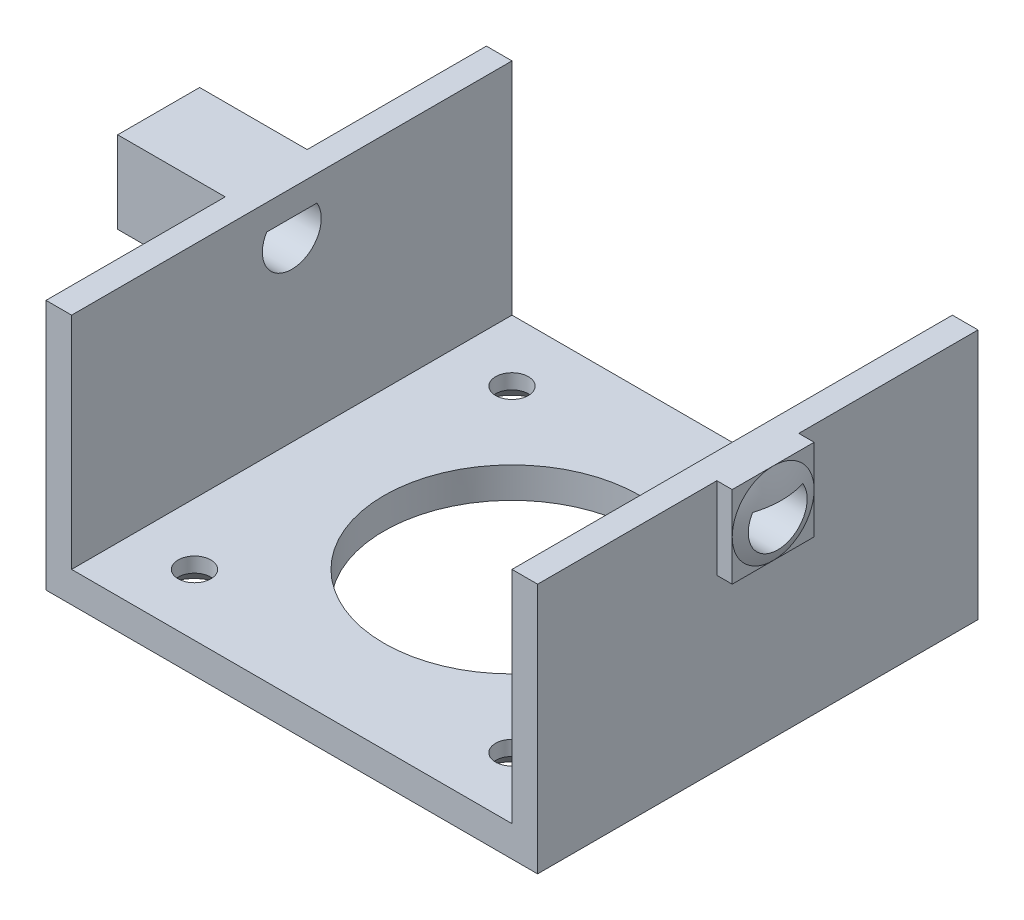
ISO-10303-21;
HEADER;
FILE_DESCRIPTION(('STEP AP214'),'2;1');
FILE_NAME('part.step','',(''),(''),'','','');
FILE_SCHEMA(('AUTOMOTIVE_DESIGN { 1 0 10303 214 1 1 1 1 }'));
ENDSEC;
DATA;
#1=APPLICATION_CONTEXT('core data for automotive mechanical design processes');
#2=APPLICATION_PROTOCOL_DEFINITION('international standard','automotive_design',2000,#1);
#3=PRODUCT_CONTEXT('',#1,'mechanical');
#4=PRODUCT('Part','Part','',(#3));
#5=PRODUCT_RELATED_PRODUCT_CATEGORY('part','',(#4));
#6=PRODUCT_DEFINITION_FORMATION('','',#4);
#7=PRODUCT_DEFINITION_CONTEXT('part definition',#1,'design');
#8=PRODUCT_DEFINITION('design','',#6,#7);
#9=PRODUCT_DEFINITION_SHAPE('','',#8);
#10=(LENGTH_UNIT() NAMED_UNIT(*) SI_UNIT(.MILLI.,.METRE.));
#11=(NAMED_UNIT(*) PLANE_ANGLE_UNIT() SI_UNIT($,.RADIAN.));
#12=(NAMED_UNIT(*) SI_UNIT($,.STERADIAN.) SOLID_ANGLE_UNIT());
#13=UNCERTAINTY_MEASURE_WITH_UNIT(LENGTH_MEASURE(1.E-05),#10,'distance_accuracy_value','');
#14=(GEOMETRIC_REPRESENTATION_CONTEXT(3) GLOBAL_UNCERTAINTY_ASSIGNED_CONTEXT((#13)) GLOBAL_UNIT_ASSIGNED_CONTEXT((#10,
#11,#12)) REPRESENTATION_CONTEXT('',''));
#15=CARTESIAN_POINT('',(0.,0.,0.));
#16=DIRECTION('',(0.,0.,1.));
#17=DIRECTION('',(1.,0.,0.));
#18=AXIS2_PLACEMENT_3D('',#15,#16,#17);
#19=CARTESIAN_POINT('',(31.,4.,0.));
#20=CARTESIAN_POINT('',(30.8896761484401,4.,-2.05859870974821));
#21=CARTESIAN_POINT('',(30.,4.,-4.));
#22=B_SPLINE_CURVE_WITH_KNOTS('',2,(#19,#20,#21),.UNSPECIFIED.,.F.,.F.,(3,3),(0.,1.),.UNSPECIFIED.);
#23=CARTESIAN_POINT('',(30.,4.,0.));
#24=DIRECTION('',(1.,0.,0.));
#25=AXIS1_PLACEMENT('',#23,#24);
#26=SURFACE_OF_REVOLUTION('',#22,#25);
#27=CARTESIAN_POINT('',(30.,4.,0.));
#28=DIRECTION('',(1.,0.,0.));
#29=DIRECTION('',(0.,0.,-1.));
#30=AXIS2_PLACEMENT_3D('',#27,#28,#29);
#31=CIRCLE('',#30,4.);
#32=CARTESIAN_POINT('',(30.,4.,-4.));
#33=VERTEX_POINT('',#32);
#34=CARTESIAN_POINT('',(30.,8.,0.));
#35=VERTEX_POINT('',#34);
#36=EDGE_CURVE('E339',#33,#35,#31,.T.);
#37=ORIENTED_EDGE('',*,*,#36,.T.);
#38=CARTESIAN_POINT('',(30.,4.,4.));
#39=VERTEX_POINT('',#38);
#40=EDGE_CURVE('E354',#35,#39,#31,.T.);
#41=ORIENTED_EDGE('',*,*,#40,.T.);
#42=CARTESIAN_POINT('',(30.,0.,0.));
#43=VERTEX_POINT('',#42);
#44=EDGE_CURVE('E492',#39,#43,#31,.T.);
#45=ORIENTED_EDGE('',*,*,#44,.T.);
#46=EDGE_CURVE('E355',#43,#33,#31,.T.);
#47=ORIENTED_EDGE('',*,*,#46,.T.);
#48=EDGE_LOOP('',(#37,#41,#45,#47));
#49=FACE_BOUND('',#48,.T.);
#50=CARTESIAN_POINT('',(30.446810805289,4.,0.));
#51=DIRECTION('',(1.,0.,0.));
#52=DIRECTION('',(0.,0.,-1.));
#53=AXIS2_PLACEMENT_3D('',#50,#51,#52);
#54=CIRCLE('',#53,2.875);
#55=CARTESIAN_POINT('',(30.446810805289,5.5,2.45267710879357));
#56=VERTEX_POINT('',#55);
#57=CARTESIAN_POINT('',(30.446810805289,5.5,-2.45267710879357));
#58=VERTEX_POINT('',#57);
#59=EDGE_CURVE('E201',#56,#58,#54,.T.);
#60=ORIENTED_EDGE('',*,*,#59,.F.);
#61=CARTESIAN_POINT('',(30.446810805289,5.5,2.45267710879357));
#62=CARTESIAN_POINT('',(30.4745891810411,5.5,2.35607944511616));
#63=CARTESIAN_POINT('',(30.5009714752411,5.5,2.25907743400865));
#64=CARTESIAN_POINT('',(30.5508486576579,5.5,2.06428555676378));
#65=CARTESIAN_POINT('',(30.5743421773343,5.5,1.96649534041547));
#66=CARTESIAN_POINT('',(30.6183235916884,5.5,1.77022381712976));
#67=CARTESIAN_POINT('',(30.6388110148051,5.5,1.67174240429911));
#68=CARTESIAN_POINT('',(30.6766552776358,5.5,1.47413021040363));
#69=CARTESIAN_POINT('',(30.6940106211985,5.5,1.37499914231465));
#70=CARTESIAN_POINT('',(30.7254208245534,5.5,1.17622044070078));
#71=CARTESIAN_POINT('',(30.7394759294033,5.5,1.07657284609228));
#72=CARTESIAN_POINT('',(30.764099546427,5.5,0.876843681115565));
#73=CARTESIAN_POINT('',(30.7746678869226,5.5,0.776762089624347));
#74=CARTESIAN_POINT('',(30.7963303596181,5.5,0.527631056143692));
#75=CARTESIAN_POINT('',(30.8051925274323,5.5,0.378379021947846));
#76=CARTESIAN_POINT('',(30.8141521990341,5.5,0.0795710430997424));
#77=CARTESIAN_POINT('',(30.8142473989585,5.5,-0.0699849711096272));
#78=CARTESIAN_POINT('',(30.8056588477177,5.5,-0.368853434239254));
#79=CARTESIAN_POINT('',(30.796974276002,5.5,-0.518165859087429));
#80=CARTESIAN_POINT('',(30.7714294345454,5.5,-0.815941641741622));
#81=CARTESIAN_POINT('',(30.7545765309906,5.5,-0.964405642837415));
#82=CARTESIAN_POINT('',(30.7133901326886,5.5,-1.26028322718815));
#83=CARTESIAN_POINT('',(30.6890565375506,5.50000000000001,-1.40769679631916));
#84=CARTESIAN_POINT('',(30.6334615264711,5.49999999999999,-1.7011535430861));
#85=CARTESIAN_POINT('',(30.60220268299,5.49999999999996,-1.84719720864553));
#86=CARTESIAN_POINT('',(30.5493331995045,5.49999999999997,-2.06967271650573));
#87=CARTESIAN_POINT('',(30.5300615094613,5.49999999999999,-2.14666888741941));
#88=CARTESIAN_POINT('',(30.489751904654,5.50000000000001,-2.30008470557383));
#89=CARTESIAN_POINT('',(30.4687164500182,5.50000000000001,-2.37650499898739));
#90=CARTESIAN_POINT('',(30.446810805289,5.5,-2.45267710879357));
#91=B_SPLINE_CURVE_WITH_KNOTS('',3,(#61,#62,#63,#64,#65,#66,#67,#68,#69,#70,#71,#72,#73,#74,#75,
#76,#77,#78,#79,#80,#81,#82,#83,#84,#85,#86,#87,#88,#89,#90),.UNSPECIFIED.,.F.,.F.,(4,2,2,2,2,2,
2,2,2,2,2,2,2,2,4),(0.,0.301530823764337,0.603203950105899,0.904924348892639,1.20678849606152,
1.50863022135821,1.81048680623926,2.25877596958753,2.70718293808567,3.1556318182228,
3.60367703833997,4.05172827147433,4.4996133492287,4.73770852684449,4.97547696049412),.UNSPECIFIED.);
#92=EDGE_CURVE('E214',#56,#58,#91,.T.);
#93=ORIENTED_EDGE('',*,*,#92,.T.);
#94=EDGE_LOOP('',(#60,#93));
#95=FACE_BOUND('',#94,.T.);
#96=ADVANCED_FACE('F41',(#49,#95),#26,.F.);
#97=CARTESIAN_POINT('',(-31.,4.,0.));
#98=CARTESIAN_POINT('',(-30.8896761484401,4.,-2.05859870974821));
#99=CARTESIAN_POINT('',(-30.,4.,-4.));
#100=B_SPLINE_CURVE_WITH_KNOTS('',2,(#97,#98,#99),.UNSPECIFIED.,.F.,.F.,(3,3),(0.,1.),.UNSPECIFIED.);
#101=CARTESIAN_POINT('',(-30.,4.,0.));
#102=DIRECTION('',(-1.,0.,0.));
#103=AXIS1_PLACEMENT('',#101,#102);
#104=SURFACE_OF_REVOLUTION('',#100,#103);
#105=CARTESIAN_POINT('',(-30.,4.,0.));
#106=DIRECTION('',(1.,0.,0.));
#107=DIRECTION('',(0.,0.,-1.));
#108=AXIS2_PLACEMENT_3D('',#105,#106,#107);
#109=CIRCLE('',#108,4.);
#110=CARTESIAN_POINT('',(-30.,4.,-4.));
#111=VERTEX_POINT('',#110);
#112=CARTESIAN_POINT('',(-30.,8.,0.));
#113=VERTEX_POINT('',#112);
#114=EDGE_CURVE('E333',#111,#113,#109,.T.);
#115=ORIENTED_EDGE('',*,*,#114,.F.);
#116=CARTESIAN_POINT('',(-30.,0.,0.));
#117=VERTEX_POINT('',#116);
#118=EDGE_CURVE('E342',#117,#111,#109,.T.);
#119=ORIENTED_EDGE('',*,*,#118,.F.);
#120=CARTESIAN_POINT('',(-30.,4.,4.));
#121=VERTEX_POINT('',#120);
#122=EDGE_CURVE('E496',#121,#117,#109,.T.);
#123=ORIENTED_EDGE('',*,*,#122,.F.);
#124=EDGE_CURVE('E341',#113,#121,#109,.T.);
#125=ORIENTED_EDGE('',*,*,#124,.F.);
#126=EDGE_LOOP('',(#115,#119,#123,#125));
#127=FACE_BOUND('',#126,.T.);
#128=CARTESIAN_POINT('',(-30.446810805289,4.,0.));
#129=DIRECTION('',(-1.,0.,0.));
#130=DIRECTION('',(0.,0.,1.));
#131=AXIS2_PLACEMENT_3D('',#128,#129,#130);
#132=CIRCLE('',#131,2.875);
#133=CARTESIAN_POINT('',(-30.446810805289,5.5,-2.45267710879357));
#134=VERTEX_POINT('',#133);
#135=CARTESIAN_POINT('',(-30.446810805289,5.5,2.45267710879357));
#136=VERTEX_POINT('',#135);
#137=EDGE_CURVE('E210',#134,#136,#132,.T.);
#138=ORIENTED_EDGE('',*,*,#137,.F.);
#139=CARTESIAN_POINT('',(-30.446810805289,5.5,-2.45267710879357));
#140=CARTESIAN_POINT('',(-30.4745891810411,5.5,-2.35607944511616));
#141=CARTESIAN_POINT('',(-30.5009714752411,5.5,-2.25907743400865));
#142=CARTESIAN_POINT('',(-30.5508486576579,5.5,-2.06428555676378));
#143=CARTESIAN_POINT('',(-30.5743421773343,5.5,-1.96649534041547));
#144=CARTESIAN_POINT('',(-30.6183235916884,5.5,-1.77022381712976));
#145=CARTESIAN_POINT('',(-30.6388110148051,5.5,-1.67174240429911));
#146=CARTESIAN_POINT('',(-30.6766552776358,5.5,-1.47413021040364));
#147=CARTESIAN_POINT('',(-30.6940106211985,5.5,-1.37499914231465));
#148=CARTESIAN_POINT('',(-30.7254208245534,5.5,-1.17622044070078));
#149=CARTESIAN_POINT('',(-30.7394759294033,5.5,-1.07657284609228));
#150=CARTESIAN_POINT('',(-30.764099546427,5.5,-0.876843681115569));
#151=CARTESIAN_POINT('',(-30.7746678869226,5.5,-0.77676208962435));
#152=CARTESIAN_POINT('',(-30.7963303596181,5.5,-0.527631056143695));
#153=CARTESIAN_POINT('',(-30.8051925274323,5.5,-0.378379021947849));
#154=CARTESIAN_POINT('',(-30.8141521990341,5.5,-0.0795710430997457));
#155=CARTESIAN_POINT('',(-30.8142473989585,5.5,0.0699849711096239));
#156=CARTESIAN_POINT('',(-30.8056588477177,5.5,0.368853434239251));
#157=CARTESIAN_POINT('',(-30.796974276002,5.5,0.518165859087425));
#158=CARTESIAN_POINT('',(-30.7714294345454,5.5,0.81594164174162));
#159=CARTESIAN_POINT('',(-30.7545765309907,5.5,0.964405642837414));
#160=CARTESIAN_POINT('',(-30.7133901326886,5.5,1.26028322718815));
#161=CARTESIAN_POINT('',(-30.6890565375507,5.50000000000001,1.40769679631915));
#162=CARTESIAN_POINT('',(-30.6334615264711,5.49999999999999,1.7011535430861));
#163=CARTESIAN_POINT('',(-30.60220268299,5.49999999999996,1.84719720864553));
#164=CARTESIAN_POINT('',(-30.5493331995045,5.49999999999997,2.06967271650573));
#165=CARTESIAN_POINT('',(-30.5300615094613,5.49999999999999,2.14666888741941));
#166=CARTESIAN_POINT('',(-30.489751904654,5.50000000000001,2.30008470557383));
#167=CARTESIAN_POINT('',(-30.4687164500182,5.50000000000002,2.37650499898738));
#168=CARTESIAN_POINT('',(-30.446810805289,5.5,2.45267710879357));
#169=B_SPLINE_CURVE_WITH_KNOTS('',3,(#139,#140,#141,#142,#143,#144,#145,#146,#147,#148,#149,
#150,#151,#152,#153,#154,#155,#156,#157,#158,#159,#160,#161,#162,#163,#164,#165,#166,#167,#168),
.UNSPECIFIED.,.F.,.F.,(4,2,2,2,2,2,2,2,2,2,2,2,2,2,4),(0.,0.301530823764337,0.603203950105897,
0.904924348892636,1.20678849606152,1.5086302213582,1.81048680623925,2.25877596958752,
2.70718293808567,3.1556318182228,3.60367703833997,4.05172827147432,4.4996133492287,
4.73770852684449,4.97547696049413),.UNSPECIFIED.);
#170=EDGE_CURVE('E221',#134,#136,#169,.T.);
#171=ORIENTED_EDGE('',*,*,#170,.T.);
#172=EDGE_LOOP('',(#138,#171));
#173=FACE_BOUND('',#172,.T.);
#174=ADVANCED_FACE('F301',(#127,#173),#104,.F.);
#175=CARTESIAN_POINT('',(-17.,0.,-21.5));
#176=DIRECTION('',(-1.,0.,0.));
#177=DIRECTION('',(0.,-1.,0.));
#178=AXIS2_PLACEMENT_3D('',#175,#176,#177);
#179=PLANE('',#178);
#180=DIRECTION('',(0.,-1.,0.));
#181=VECTOR('',#180,1.);
#182=CARTESIAN_POINT('',(-17.,0.,-21.5));
#183=LINE('',#182,#181);
#184=CARTESIAN_POINT('',(-17.,8.,-21.5));
#185=VERTEX_POINT('',#184);
#186=CARTESIAN_POINT('',(-17.,-13.5,-21.5));
#187=VERTEX_POINT('',#186);
#188=EDGE_CURVE('E522',#185,#187,#183,.T.);
#189=ORIENTED_EDGE('',*,*,#188,.F.);
#190=DIRECTION('',(0.,0.,1.));
#191=VECTOR('',#190,1.);
#192=CARTESIAN_POINT('',(-17.,8.,4.));
#193=LINE('',#192,#191);
#194=CARTESIAN_POINT('',(-17.,8.,21.5));
#195=VERTEX_POINT('',#194);
#196=EDGE_CURVE('E564',#185,#195,#193,.T.);
#197=ORIENTED_EDGE('',*,*,#196,.T.);
#198=DIRECTION('',(0.,-1.,0.));
#199=VECTOR('',#198,1.);
#200=CARTESIAN_POINT('',(-17.,0.,21.5));
#201=LINE('',#200,#199);
#202=CARTESIAN_POINT('',(-17.,-13.5,21.5));
#203=VERTEX_POINT('',#202);
#204=EDGE_CURVE('E541',#195,#203,#201,.T.);
#205=ORIENTED_EDGE('',*,*,#204,.T.);
#206=DIRECTION('',(0.,0.,1.));
#207=VECTOR('',#206,1.);
#208=CARTESIAN_POINT('',(-17.,-13.5,-21.5));
#209=LINE('',#208,#207);
#210=EDGE_CURVE('E340',#187,#203,#209,.T.);
#211=ORIENTED_EDGE('',*,*,#210,.F.);
#212=EDGE_LOOP('',(#189,#197,#205,#211));
#213=FACE_BOUND('',#212,.T.);
#214=DIRECTION('',(0.,0.,1.));
#215=VECTOR('',#214,1.);
#216=CARTESIAN_POINT('',(-17.,5.5,-21.5));
#217=LINE('',#216,#215);
#218=CARTESIAN_POINT('',(-17.,5.5,-2.45267710879357));
#219=VERTEX_POINT('',#218);
#220=CARTESIAN_POINT('',(-17.,5.5,2.45267710879357));
#221=VERTEX_POINT('',#220);
#222=EDGE_CURVE('E209',#219,#221,#217,.T.);
#223=ORIENTED_EDGE('',*,*,#222,.F.);
#224=CARTESIAN_POINT('',(-17.,4.,0.));
#225=DIRECTION('',(-1.,0.,0.));
#226=DIRECTION('',(0.,-1.,0.));
#227=AXIS2_PLACEMENT_3D('',#224,#225,#226);
#228=CIRCLE('',#227,2.875);
#229=EDGE_CURVE('E447',#219,#221,#228,.T.);
#230=ORIENTED_EDGE('',*,*,#229,.T.);
#231=EDGE_LOOP('',(#223,#230));
#232=FACE_BOUND('',#231,.T.);
#233=ADVANCED_FACE('F297',(#213,#232),#179,.F.);
#234=CARTESIAN_POINT('',(26.,0.,-21.5));
#235=DIRECTION('',(-1.,0.,0.));
#236=DIRECTION('',(0.,-1.,0.));
#237=AXIS2_PLACEMENT_3D('',#234,#235,#236);
#238=PLANE('',#237);
#239=DIRECTION('',(0.,0.,-1.));
#240=VECTOR('',#239,1.);
#241=CARTESIAN_POINT('',(26.,8.,4.));
#242=LINE('',#241,#240);
#243=CARTESIAN_POINT('',(26.,8.00000000000001,21.5));
#244=VERTEX_POINT('',#243);
#245=CARTESIAN_POINT('',(26.,8.00000000000001,-21.5));
#246=VERTEX_POINT('',#245);
#247=EDGE_CURVE('E567',#244,#246,#242,.T.);
#248=ORIENTED_EDGE('',*,*,#247,.T.);
#249=DIRECTION('',(0.,-1.,0.));
#250=VECTOR('',#249,1.);
#251=CARTESIAN_POINT('',(26.,0.,-21.5));
#252=LINE('',#251,#250);
#253=CARTESIAN_POINT('',(26.,-13.5,-21.5));
#254=VERTEX_POINT('',#253);
#255=EDGE_CURVE('E528',#246,#254,#252,.T.);
#256=ORIENTED_EDGE('',*,*,#255,.T.);
#257=DIRECTION('',(0.,0.,1.));
#258=VECTOR('',#257,1.);
#259=CARTESIAN_POINT('',(26.,-13.5,-21.5));
#260=LINE('',#259,#258);
#261=CARTESIAN_POINT('',(26.,-13.5,21.5));
#262=VERTEX_POINT('',#261);
#263=EDGE_CURVE('E515',#254,#262,#260,.T.);
#264=ORIENTED_EDGE('',*,*,#263,.T.);
#265=DIRECTION('',(0.,-1.,0.));
#266=VECTOR('',#265,1.);
#267=CARTESIAN_POINT('',(26.,0.,21.5));
#268=LINE('',#267,#266);
#269=EDGE_CURVE('E549',#244,#262,#268,.T.);
#270=ORIENTED_EDGE('',*,*,#269,.F.);
#271=EDGE_LOOP('',(#248,#256,#264,#270));
#272=FACE_BOUND('',#271,.T.);
#273=CARTESIAN_POINT('',(26.,4.,0.));
#274=DIRECTION('',(-1.,0.,0.));
#275=DIRECTION('',(0.,-1.,0.));
#276=AXIS2_PLACEMENT_3D('',#273,#274,#275);
#277=CIRCLE('',#276,2.875);
#278=CARTESIAN_POINT('',(26.,5.5,-2.45267710879357));
#279=VERTEX_POINT('',#278);
#280=CARTESIAN_POINT('',(26.,5.5,2.45267710879357));
#281=VERTEX_POINT('',#280);
#282=EDGE_CURVE('E50',#279,#281,#277,.T.);
#283=ORIENTED_EDGE('',*,*,#282,.F.);
#284=DIRECTION('',(0.,0.,1.));
#285=VECTOR('',#284,1.);
#286=CARTESIAN_POINT('',(26.,5.5,-21.5));
#287=LINE('',#286,#285);
#288=EDGE_CURVE('E11',#279,#281,#287,.T.);
#289=ORIENTED_EDGE('',*,*,#288,.T.);
#290=EDGE_LOOP('',(#283,#289));
#291=FACE_BOUND('',#290,.T.);
#292=ADVANCED_FACE('F300',(#272,#291),#238,.T.);
#293=CARTESIAN_POINT('',(-30.,8.,-4.));
#294=DIRECTION('',(0.,0.,1.));
#295=DIRECTION('',(1.,0.,0.));
#296=AXIS2_PLACEMENT_3D('',#293,#294,#295);
#297=PLANE('',#296);
#298=DIRECTION('',(-1.,0.,0.));
#299=VECTOR('',#298,1.);
#300=CARTESIAN_POINT('',(-30.,0.,-4.));
#301=LINE('',#300,#299);
#302=CARTESIAN_POINT('',(30.,0.,-4.));
#303=VERTEX_POINT('',#302);
#304=CARTESIAN_POINT('',(28.5,0.,-4.));
#305=VERTEX_POINT('',#304);
#306=EDGE_CURVE('E382',#303,#305,#301,.T.);
#307=ORIENTED_EDGE('',*,*,#306,.T.);
#308=DIRECTION('',(0.,1.,0.));
#309=VECTOR('',#308,1.);
#310=CARTESIAN_POINT('',(28.5,8.,-4.));
#311=LINE('',#310,#309);
#312=CARTESIAN_POINT('',(28.5,8.00000000000001,-4.));
#313=VERTEX_POINT('',#312);
#314=EDGE_CURVE('E570',#305,#313,#311,.T.);
#315=ORIENTED_EDGE('',*,*,#314,.T.);
#316=DIRECTION('',(-1.,0.,0.));
#317=VECTOR('',#316,1.);
#318=CARTESIAN_POINT('',(-30.,8.,-4.));
#319=LINE('',#318,#317);
#320=CARTESIAN_POINT('',(30.,8.,-4.));
#321=VERTEX_POINT('',#320);
#322=EDGE_CURVE('E362',#321,#313,#319,.T.);
#323=ORIENTED_EDGE('',*,*,#322,.F.);
#324=DIRECTION('',(0.,-1.,0.));
#325=VECTOR('',#324,1.);
#326=CARTESIAN_POINT('',(30.,8.,-4.));
#327=LINE('',#326,#325);
#328=EDGE_CURVE('E411',#321,#33,#327,.T.);
#329=ORIENTED_EDGE('',*,*,#328,.T.);
#330=EDGE_CURVE('E410',#33,#303,#327,.T.);
#331=ORIENTED_EDGE('',*,*,#330,.T.);
#332=EDGE_LOOP('',(#307,#315,#323,#329,#331));
#333=FACE_BOUND('',#332,.T.);
#334=ADVANCED_FACE('F311',(#333),#297,.F.);
#335=CARTESIAN_POINT('',(-30.,8.,4.));
#336=DIRECTION('',(0.,0.,-1.));
#337=DIRECTION('',(-1.,0.,0.));
#338=AXIS2_PLACEMENT_3D('',#335,#336,#337);
#339=PLANE('',#338);
#340=DIRECTION('',(1.,0.,0.));
#341=VECTOR('',#340,1.);
#342=CARTESIAN_POINT('',(-30.,8.,4.));
#343=LINE('',#342,#341);
#344=CARTESIAN_POINT('',(28.5,8.,4.));
#345=VERTEX_POINT('',#344);
#346=CARTESIAN_POINT('',(30.,8.,4.));
#347=VERTEX_POINT('',#346);
#348=EDGE_CURVE('E371',#345,#347,#343,.T.);
#349=ORIENTED_EDGE('',*,*,#348,.F.);
#350=DIRECTION('',(0.,-1.,0.));
#351=VECTOR('',#350,1.);
#352=CARTESIAN_POINT('',(28.5,8.,4.));
#353=LINE('',#352,#351);
#354=CARTESIAN_POINT('',(28.5,0.,4.));
#355=VERTEX_POINT('',#354);
#356=EDGE_CURVE('E574',#345,#355,#353,.T.);
#357=ORIENTED_EDGE('',*,*,#356,.T.);
#358=DIRECTION('',(1.,0.,0.));
#359=VECTOR('',#358,1.);
#360=CARTESIAN_POINT('',(-30.,0.,4.));
#361=LINE('',#360,#359);
#362=CARTESIAN_POINT('',(30.,0.,4.));
#363=VERTEX_POINT('',#362);
#364=EDGE_CURVE('E391',#355,#363,#361,.T.);
#365=ORIENTED_EDGE('',*,*,#364,.T.);
#366=DIRECTION('',(0.,-1.,0.));
#367=VECTOR('',#366,1.);
#368=CARTESIAN_POINT('',(30.,8.,4.));
#369=LINE('',#368,#367);
#370=EDGE_CURVE('E376',#39,#363,#369,.T.);
#371=ORIENTED_EDGE('',*,*,#370,.F.);
#372=EDGE_CURVE('E396',#347,#39,#369,.T.);
#373=ORIENTED_EDGE('',*,*,#372,.F.);
#374=EDGE_LOOP('',(#349,#357,#365,#371,#373));
#375=FACE_BOUND('',#374,.T.);
#376=ADVANCED_FACE('F716',(#375),#339,.F.);
#377=CARTESIAN_POINT('',(0.,8.,0.));
#378=DIRECTION('',(0.,-1.,0.));
#379=DIRECTION('',(0.,0.,-1.));
#380=AXIS2_PLACEMENT_3D('',#377,#378,#379);
#381=PLANE('',#380);
#382=ORIENTED_EDGE('',*,*,#322,.T.);
#383=DIRECTION('',(0.,0.,-1.));
#384=VECTOR('',#383,1.);
#385=CARTESIAN_POINT('',(28.5,8.00000000000001,-21.5));
#386=LINE('',#385,#384);
#387=CARTESIAN_POINT('',(28.5,8.00000000000001,-21.5));
#388=VERTEX_POINT('',#387);
#389=EDGE_CURVE('E588',#313,#388,#386,.T.);
#390=ORIENTED_EDGE('',*,*,#389,.T.);
#391=DIRECTION('',(-1.,0.,0.));
#392=VECTOR('',#391,1.);
#393=CARTESIAN_POINT('',(28.5,8.00000000000001,-21.5));
#394=LINE('',#393,#392);
#395=EDGE_CURVE('E577',#388,#246,#394,.T.);
#396=ORIENTED_EDGE('',*,*,#395,.T.);
#397=ORIENTED_EDGE('',*,*,#247,.F.);
#398=DIRECTION('',(-1.,0.,0.));
#399=VECTOR('',#398,1.);
#400=CARTESIAN_POINT('',(28.5,8.00000000000001,21.5));
#401=LINE('',#400,#399);
#402=CARTESIAN_POINT('',(28.5,8.00000000000001,21.5));
#403=VERTEX_POINT('',#402);
#404=EDGE_CURVE('E581',#403,#244,#401,.T.);
#405=ORIENTED_EDGE('',*,*,#404,.F.);
#406=EDGE_CURVE('E585',#403,#345,#386,.T.);
#407=ORIENTED_EDGE('',*,*,#406,.T.);
#408=ORIENTED_EDGE('',*,*,#348,.T.);
#409=DIRECTION('',(0.,0.,-1.));
#410=VECTOR('',#409,1.);
#411=CARTESIAN_POINT('',(30.,8.,4.));
#412=LINE('',#411,#410);
#413=EDGE_CURVE('E356',#347,#35,#412,.T.);
#414=ORIENTED_EDGE('',*,*,#413,.T.);
#415=EDGE_CURVE('E361',#35,#321,#412,.T.);
#416=ORIENTED_EDGE('',*,*,#415,.T.);
#417=EDGE_LOOP('',(#382,#390,#396,#397,#405,#407,#408,#414,#416));
#418=FACE_BOUND('',#417,.T.);
#419=ADVANCED_FACE('F486',(#418),#381,.F.);
#420=CARTESIAN_POINT('',(0.,0.,0.));
#421=DIRECTION('',(0.,-1.,0.));
#422=DIRECTION('',(0.,0.,-1.));
#423=AXIS2_PLACEMENT_3D('',#420,#421,#422);
#424=PLANE('',#423);
#425=CARTESIAN_POINT('',(-19.5,0.,-4.));
#426=VERTEX_POINT('',#425);
#427=CARTESIAN_POINT('',(-30.,0.,-4.));
#428=VERTEX_POINT('',#427);
#429=EDGE_CURVE('E381',#426,#428,#301,.T.);
#430=ORIENTED_EDGE('',*,*,#429,.F.);
#431=DIRECTION('',(0.,0.,1.));
#432=VECTOR('',#431,1.);
#433=CARTESIAN_POINT('',(-19.5,0.,0.));
#434=LINE('',#433,#432);
#435=CARTESIAN_POINT('',(-19.5,0.,4.));
#436=VERTEX_POINT('',#435);
#437=EDGE_CURVE('E418',#426,#436,#434,.T.);
#438=ORIENTED_EDGE('',*,*,#437,.T.);
#439=CARTESIAN_POINT('',(-30.,0.,4.));
#440=VERTEX_POINT('',#439);
#441=EDGE_CURVE('E392',#440,#436,#361,.T.);
#442=ORIENTED_EDGE('',*,*,#441,.F.);
#443=DIRECTION('',(0.,0.,1.));
#444=VECTOR('',#443,1.);
#445=CARTESIAN_POINT('',(-30.,0.,4.));
#446=LINE('',#445,#444);
#447=EDGE_CURVE('E386',#117,#440,#446,.T.);
#448=ORIENTED_EDGE('',*,*,#447,.F.);
#449=EDGE_CURVE('E387',#428,#117,#446,.T.);
#450=ORIENTED_EDGE('',*,*,#449,.F.);
#451=EDGE_LOOP('',(#430,#438,#442,#448,#450));
#452=FACE_BOUND('',#451,.T.);
#453=ADVANCED_FACE('F695',(#452),#424,.T.);
#454=ORIENTED_EDGE('',*,*,#364,.F.);
#455=DIRECTION('',(0.,0.,-1.));
#456=VECTOR('',#455,1.);
#457=CARTESIAN_POINT('',(28.5,0.,0.));
#458=LINE('',#457,#456);
#459=EDGE_CURVE('E414',#355,#305,#458,.T.);
#460=ORIENTED_EDGE('',*,*,#459,.T.);
#461=ORIENTED_EDGE('',*,*,#306,.F.);
#462=DIRECTION('',(0.,0.,-1.));
#463=VECTOR('',#462,1.);
#464=CARTESIAN_POINT('',(30.,0.,4.));
#465=LINE('',#464,#463);
#466=EDGE_CURVE('E353',#43,#303,#465,.T.);
#467=ORIENTED_EDGE('',*,*,#466,.F.);
#468=EDGE_CURVE('E377',#363,#43,#465,.T.);
#469=ORIENTED_EDGE('',*,*,#468,.F.);
#470=EDGE_LOOP('',(#454,#460,#461,#467,#469));
#471=FACE_BOUND('',#470,.T.);
#472=ADVANCED_FACE('F718',(#471),#424,.T.);
#473=CARTESIAN_POINT('',(-30.,8.,4.));
#474=DIRECTION('',(1.,0.,0.));
#475=DIRECTION('',(0.,0.,-1.));
#476=AXIS2_PLACEMENT_3D('',#473,#474,#475);
#477=PLANE('',#476);
#478=DIRECTION('',(0.,-1.,0.));
#479=VECTOR('',#478,1.);
#480=CARTESIAN_POINT('',(-30.,8.,-4.));
#481=LINE('',#480,#479);
#482=CARTESIAN_POINT('',(-30.,8.,-4.));
#483=VERTEX_POINT('',#482);
#484=EDGE_CURVE('E406',#483,#111,#481,.T.);
#485=ORIENTED_EDGE('',*,*,#484,.T.);
#486=ORIENTED_EDGE('',*,*,#114,.T.);
#487=DIRECTION('',(0.,0.,1.));
#488=VECTOR('',#487,1.);
#489=CARTESIAN_POINT('',(-30.,8.,4.));
#490=LINE('',#489,#488);
#491=EDGE_CURVE('E367',#483,#113,#490,.T.);
#492=ORIENTED_EDGE('',*,*,#491,.F.);
#493=EDGE_LOOP('',(#485,#486,#492));
#494=FACE_BOUND('',#493,.T.);
#495=ADVANCED_FACE('F680',(#494),#477,.F.);
#496=CARTESIAN_POINT('',(-30.,8.,4.));
#497=VERTEX_POINT('',#496);
#498=EDGE_CURVE('E366',#113,#497,#490,.T.);
#499=ORIENTED_EDGE('',*,*,#498,.F.);
#500=ORIENTED_EDGE('',*,*,#124,.T.);
#501=DIRECTION('',(0.,-1.,0.));
#502=VECTOR('',#501,1.);
#503=CARTESIAN_POINT('',(-30.,8.,4.));
#504=LINE('',#503,#502);
#505=EDGE_CURVE('E401',#497,#121,#504,.T.);
#506=ORIENTED_EDGE('',*,*,#505,.F.);
#507=EDGE_LOOP('',(#499,#500,#506));
#508=FACE_BOUND('',#507,.T.);
#509=ADVANCED_FACE('F686',(#508),#477,.F.);
#510=EDGE_CURVE('E400',#121,#440,#504,.T.);
#511=ORIENTED_EDGE('',*,*,#510,.F.);
#512=ORIENTED_EDGE('',*,*,#122,.T.);
#513=ORIENTED_EDGE('',*,*,#447,.T.);
#514=EDGE_LOOP('',(#511,#512,#513));
#515=FACE_BOUND('',#514,.T.);
#516=ADVANCED_FACE('F701',(#515),#477,.F.);
#517=CARTESIAN_POINT('',(30.,8.,4.));
#518=DIRECTION('',(-1.,0.,0.));
#519=DIRECTION('',(0.,0.,1.));
#520=AXIS2_PLACEMENT_3D('',#517,#518,#519);
#521=PLANE('',#520);
#522=ORIENTED_EDGE('',*,*,#36,.F.);
#523=ORIENTED_EDGE('',*,*,#328,.F.);
#524=ORIENTED_EDGE('',*,*,#415,.F.);
#525=EDGE_LOOP('',(#522,#523,#524));
#526=FACE_BOUND('',#525,.T.);
#527=ADVANCED_FACE('F481',(#526),#521,.F.);
#528=ORIENTED_EDGE('',*,*,#40,.F.);
#529=ORIENTED_EDGE('',*,*,#413,.F.);
#530=ORIENTED_EDGE('',*,*,#372,.T.);
#531=EDGE_LOOP('',(#528,#529,#530));
#532=FACE_BOUND('',#531,.T.);
#533=ADVANCED_FACE('F490',(#532),#521,.F.);
#534=ORIENTED_EDGE('',*,*,#44,.F.);
#535=ORIENTED_EDGE('',*,*,#370,.T.);
#536=ORIENTED_EDGE('',*,*,#468,.T.);
#537=EDGE_LOOP('',(#534,#535,#536));
#538=FACE_BOUND('',#537,.T.);
#539=ADVANCED_FACE('F746',(#538),#521,.F.);
#540=ORIENTED_EDGE('',*,*,#46,.F.);
#541=ORIENTED_EDGE('',*,*,#466,.T.);
#542=ORIENTED_EDGE('',*,*,#330,.F.);
#543=EDGE_LOOP('',(#540,#541,#542));
#544=FACE_BOUND('',#543,.T.);
#545=ADVANCED_FACE('F43',(#544),#521,.F.);
#546=CARTESIAN_POINT('',(-19.5,8.,-4.));
#547=VERTEX_POINT('',#546);
#548=EDGE_CURVE('E360',#547,#483,#319,.T.);
#549=ORIENTED_EDGE('',*,*,#548,.F.);
#550=DIRECTION('',(0.,-1.,0.));
#551=VECTOR('',#550,1.);
#552=CARTESIAN_POINT('',(-19.5,8.00000000000001,-4.));
#553=LINE('',#552,#551);
#554=EDGE_CURVE('E592',#547,#426,#553,.T.);
#555=ORIENTED_EDGE('',*,*,#554,.T.);
#556=ORIENTED_EDGE('',*,*,#429,.T.);
#557=EDGE_CURVE('E405',#111,#428,#481,.T.);
#558=ORIENTED_EDGE('',*,*,#557,.F.);
#559=ORIENTED_EDGE('',*,*,#484,.F.);
#560=EDGE_LOOP('',(#549,#555,#556,#558,#559));
#561=FACE_BOUND('',#560,.T.);
#562=ADVANCED_FACE('F676',(#561),#297,.F.);
#563=ORIENTED_EDGE('',*,*,#449,.T.);
#564=ORIENTED_EDGE('',*,*,#118,.T.);
#565=ORIENTED_EDGE('',*,*,#557,.T.);
#566=EDGE_LOOP('',(#563,#564,#565));
#567=FACE_BOUND('',#566,.T.);
#568=ADVANCED_FACE('F698',(#567),#477,.F.);
#569=ORIENTED_EDGE('',*,*,#441,.T.);
#570=DIRECTION('',(0.,1.,0.));
#571=VECTOR('',#570,1.);
#572=CARTESIAN_POINT('',(-19.5,8.00000000000001,4.));
#573=LINE('',#572,#571);
#574=CARTESIAN_POINT('',(-19.5,8.,4.));
#575=VERTEX_POINT('',#574);
#576=EDGE_CURVE('E594',#436,#575,#573,.T.);
#577=ORIENTED_EDGE('',*,*,#576,.T.);
#578=EDGE_CURVE('E372',#497,#575,#343,.T.);
#579=ORIENTED_EDGE('',*,*,#578,.F.);
#580=ORIENTED_EDGE('',*,*,#505,.T.);
#581=ORIENTED_EDGE('',*,*,#510,.T.);
#582=EDGE_LOOP('',(#569,#577,#579,#580,#581));
#583=FACE_BOUND('',#582,.T.);
#584=ADVANCED_FACE('F689',(#583),#339,.F.);
#585=ORIENTED_EDGE('',*,*,#578,.T.);
#586=DIRECTION('',(0.,0.,1.));
#587=VECTOR('',#586,1.);
#588=CARTESIAN_POINT('',(-19.5,8.,-21.5));
#589=LINE('',#588,#587);
#590=CARTESIAN_POINT('',(-19.5,8.,21.5));
#591=VERTEX_POINT('',#590);
#592=EDGE_CURVE('E425',#575,#591,#589,.T.);
#593=ORIENTED_EDGE('',*,*,#592,.T.);
#594=DIRECTION('',(1.,0.,0.));
#595=VECTOR('',#594,1.);
#596=CARTESIAN_POINT('',(-19.5,8.,21.5));
#597=LINE('',#596,#595);
#598=EDGE_CURVE('E597',#591,#195,#597,.T.);
#599=ORIENTED_EDGE('',*,*,#598,.T.);
#600=ORIENTED_EDGE('',*,*,#196,.F.);
#601=DIRECTION('',(1.,0.,0.));
#602=VECTOR('',#601,1.);
#603=CARTESIAN_POINT('',(-19.5,8.,-21.5));
#604=LINE('',#603,#602);
#605=CARTESIAN_POINT('',(-19.5,8.,-21.5));
#606=VERTEX_POINT('',#605);
#607=EDGE_CURVE('E601',#606,#185,#604,.T.);
#608=ORIENTED_EDGE('',*,*,#607,.F.);
#609=EDGE_CURVE('E605',#606,#547,#589,.T.);
#610=ORIENTED_EDGE('',*,*,#609,.T.);
#611=ORIENTED_EDGE('',*,*,#548,.T.);
#612=ORIENTED_EDGE('',*,*,#491,.T.);
#613=ORIENTED_EDGE('',*,*,#498,.T.);
#614=EDGE_LOOP('',(#585,#593,#599,#600,#608,#610,#611,#612,#613));
#615=FACE_BOUND('',#614,.T.);
#616=ADVANCED_FACE('F320',(#615),#381,.F.);
#617=CARTESIAN_POINT('',(-19.5,0.,-21.5));
#618=DIRECTION('',(1.,0.,0.));
#619=DIRECTION('',(0.,0.,-1.));
#620=AXIS2_PLACEMENT_3D('',#617,#618,#619);
#621=PLANE('',#620);
#622=DIRECTION('',(0.,0.,1.));
#623=VECTOR('',#622,1.);
#624=CARTESIAN_POINT('',(-19.5,-16.5,-21.5));
#625=LINE('',#624,#623);
#626=CARTESIAN_POINT('',(-19.5,-16.5,-21.5));
#627=VERTEX_POINT('',#626);
#628=CARTESIAN_POINT('',(-19.5,-16.5,21.5));
#629=VERTEX_POINT('',#628);
#630=EDGE_CURVE('E331',#627,#629,#625,.T.);
#631=ORIENTED_EDGE('',*,*,#630,.T.);
#632=DIRECTION('',(0.,1.,0.));
#633=VECTOR('',#632,1.);
#634=CARTESIAN_POINT('',(-19.5,0.,21.5));
#635=LINE('',#634,#633);
#636=EDGE_CURVE('E561',#629,#591,#635,.T.);
#637=ORIENTED_EDGE('',*,*,#636,.T.);
#638=ORIENTED_EDGE('',*,*,#592,.F.);
#639=ORIENTED_EDGE('',*,*,#576,.F.);
#640=ORIENTED_EDGE('',*,*,#437,.F.);
#641=ORIENTED_EDGE('',*,*,#554,.F.);
#642=ORIENTED_EDGE('',*,*,#609,.F.);
#643=DIRECTION('',(0.,1.,0.));
#644=VECTOR('',#643,1.);
#645=CARTESIAN_POINT('',(-19.5,0.,-21.5));
#646=LINE('',#645,#644);
#647=EDGE_CURVE('E538',#627,#606,#646,.T.);
#648=ORIENTED_EDGE('',*,*,#647,.F.);
#649=EDGE_LOOP('',(#631,#637,#638,#639,#640,#641,#642,#648));
#650=FACE_BOUND('',#649,.T.);
#651=ADVANCED_FACE('F307',(#650),#621,.F.);
#652=CARTESIAN_POINT('',(0.,-13.5,-21.5));
#653=DIRECTION('',(0.,1.,0.));
#654=DIRECTION('',(-1.,0.,0.));
#655=AXIS2_PLACEMENT_3D('',#652,#653,#654);
#656=PLANE('',#655);
#657=CARTESIAN_POINT('',(4.50000000000001,-13.5,0.));
#658=DIRECTION('',(0.,1.,0.));
#659=DIRECTION('',(-1.,0.,0.));
#660=AXIS2_PLACEMENT_3D('',#657,#658,#659);
#661=CIRCLE('',#660,12.5);
#662=CARTESIAN_POINT('',(-7.99999999999999,-13.5,0.));
#663=VERTEX_POINT('',#662);
#664=EDGE_CURVE('E226',#663,#663,#661,.T.);
#665=ORIENTED_EDGE('',*,*,#664,.F.);
#666=EDGE_LOOP('',(#665));
#667=FACE_BOUND('',#666,.T.);
#668=CARTESIAN_POINT('',(-11.,-13.5,15.5));
#669=DIRECTION('',(0.,1.,0.));
#670=DIRECTION('',(-1.,0.,0.));
#671=AXIS2_PLACEMENT_3D('',#668,#669,#670);
#672=CIRCLE('',#671,1.6);
#673=CARTESIAN_POINT('',(-12.6,-13.5,15.5));
#674=VERTEX_POINT('',#673);
#675=EDGE_CURVE('E439',#674,#674,#672,.T.);
#676=ORIENTED_EDGE('',*,*,#675,.F.);
#677=EDGE_LOOP('',(#676));
#678=FACE_BOUND('',#677,.T.);
#679=CARTESIAN_POINT('',(20.,-13.5,15.5));
#680=DIRECTION('',(0.,1.,0.));
#681=DIRECTION('',(-1.,0.,0.));
#682=AXIS2_PLACEMENT_3D('',#679,#680,#681);
#683=CIRCLE('',#682,1.6);
#684=CARTESIAN_POINT('',(18.4,-13.5,15.5));
#685=VERTEX_POINT('',#684);
#686=EDGE_CURVE('E433',#685,#685,#683,.T.);
#687=ORIENTED_EDGE('',*,*,#686,.F.);
#688=EDGE_LOOP('',(#687));
#689=FACE_BOUND('',#688,.T.);
#690=CARTESIAN_POINT('',(20.,-13.5,-15.5));
#691=DIRECTION('',(0.,1.,0.));
#692=DIRECTION('',(-1.,0.,0.));
#693=AXIS2_PLACEMENT_3D('',#690,#691,#692);
#694=CIRCLE('',#693,1.6);
#695=CARTESIAN_POINT('',(18.4,-13.5,-15.5));
#696=VERTEX_POINT('',#695);
#697=EDGE_CURVE('E427',#696,#696,#694,.T.);
#698=ORIENTED_EDGE('',*,*,#697,.F.);
#699=EDGE_LOOP('',(#698));
#700=FACE_BOUND('',#699,.T.);
#701=CARTESIAN_POINT('',(-11.,-13.5,-15.5));
#702=DIRECTION('',(0.,1.,0.));
#703=DIRECTION('',(-1.,0.,0.));
#704=AXIS2_PLACEMENT_3D('',#701,#702,#703);
#705=CIRCLE('',#704,1.6);
#706=CARTESIAN_POINT('',(-12.6,-13.5,-15.5));
#707=VERTEX_POINT('',#706);
#708=EDGE_CURVE('E421',#707,#707,#705,.T.);
#709=ORIENTED_EDGE('',*,*,#708,.F.);
#710=EDGE_LOOP('',(#709));
#711=FACE_BOUND('',#710,.T.);
#712=ORIENTED_EDGE('',*,*,#210,.T.);
#713=DIRECTION('',(-1.,0.,0.));
#714=VECTOR('',#713,1.);
#715=CARTESIAN_POINT('',(0.,-13.5,21.5));
#716=LINE('',#715,#714);
#717=EDGE_CURVE('E545',#262,#203,#716,.T.);
#718=ORIENTED_EDGE('',*,*,#717,.F.);
#719=ORIENTED_EDGE('',*,*,#263,.F.);
#720=DIRECTION('',(-1.,0.,0.));
#721=VECTOR('',#720,1.);
#722=CARTESIAN_POINT('',(0.,-13.5,-21.5));
#723=LINE('',#722,#721);
#724=EDGE_CURVE('E524',#254,#187,#723,.T.);
#725=ORIENTED_EDGE('',*,*,#724,.T.);
#726=EDGE_LOOP('',(#712,#718,#719,#725));
#727=FACE_BOUND('',#726,.T.);
#728=ADVANCED_FACE('F303',(#667,#678,#689,#700,#711,#727),#656,.T.);
#729=CARTESIAN_POINT('',(28.5,0.,-21.5));
#730=DIRECTION('',(-1.,0.,0.));
#731=DIRECTION('',(0.,0.,1.));
#732=AXIS2_PLACEMENT_3D('',#729,#730,#731);
#733=PLANE('',#732);
#734=DIRECTION('',(0.,-1.,0.));
#735=VECTOR('',#734,1.);
#736=CARTESIAN_POINT('',(28.5,0.,-21.5));
#737=LINE('',#736,#735);
#738=CARTESIAN_POINT('',(28.5,-16.5,-21.5));
#739=VERTEX_POINT('',#738);
#740=EDGE_CURVE('E532',#388,#739,#737,.T.);
#741=ORIENTED_EDGE('',*,*,#740,.F.);
#742=ORIENTED_EDGE('',*,*,#389,.F.);
#743=ORIENTED_EDGE('',*,*,#314,.F.);
#744=ORIENTED_EDGE('',*,*,#459,.F.);
#745=ORIENTED_EDGE('',*,*,#356,.F.);
#746=ORIENTED_EDGE('',*,*,#406,.F.);
#747=DIRECTION('',(0.,-1.,0.));
#748=VECTOR('',#747,1.);
#749=CARTESIAN_POINT('',(28.5,0.,21.5));
#750=LINE('',#749,#748);
#751=CARTESIAN_POINT('',(28.5,-16.5,21.5));
#752=VERTEX_POINT('',#751);
#753=EDGE_CURVE('E553',#403,#752,#750,.T.);
#754=ORIENTED_EDGE('',*,*,#753,.T.);
#755=DIRECTION('',(0.,0.,1.));
#756=VECTOR('',#755,1.);
#757=CARTESIAN_POINT('',(28.5,-16.5,-21.5));
#758=LINE('',#757,#756);
#759=EDGE_CURVE('E518',#739,#752,#758,.T.);
#760=ORIENTED_EDGE('',*,*,#759,.F.);
#761=EDGE_LOOP('',(#741,#742,#743,#744,#745,#746,#754,#760));
#762=FACE_BOUND('',#761,.T.);
#763=ADVANCED_FACE('F306',(#762),#733,.F.);
#764=CARTESIAN_POINT('',(0.,-16.5,-21.5));
#765=DIRECTION('',(0.,1.,0.));
#766=DIRECTION('',(-1.,0.,0.));
#767=AXIS2_PLACEMENT_3D('',#764,#765,#766);
#768=PLANE('',#767);
#769=CARTESIAN_POINT('',(4.50000000000002,-16.5,0.));
#770=DIRECTION('',(0.,-1.,0.));
#771=DIRECTION('',(1.,0.,0.));
#772=AXIS2_PLACEMENT_3D('',#769,#770,#771);
#773=CIRCLE('',#772,12.5);
#774=CARTESIAN_POINT('',(17.,-16.5,0.));
#775=VERTEX_POINT('',#774);
#776=EDGE_CURVE('E220',#775,#775,#773,.T.);
#777=ORIENTED_EDGE('',*,*,#776,.F.);
#778=EDGE_LOOP('',(#777));
#779=FACE_BOUND('',#778,.T.);
#780=CARTESIAN_POINT('',(-11.,-16.5,15.5));
#781=DIRECTION('',(0.,-1.,0.));
#782=DIRECTION('',(0.,0.,-1.));
#783=AXIS2_PLACEMENT_3D('',#780,#781,#782);
#784=CIRCLE('',#783,3.15);
#785=CARTESIAN_POINT('',(-11.,-16.5,12.35));
#786=VERTEX_POINT('',#785);
#787=EDGE_CURVE('E632',#786,#786,#784,.T.);
#788=ORIENTED_EDGE('',*,*,#787,.F.);
#789=EDGE_LOOP('',(#788));
#790=FACE_BOUND('',#789,.T.);
#791=CARTESIAN_POINT('',(20.,-16.5,15.5));
#792=DIRECTION('',(0.,-1.,0.));
#793=DIRECTION('',(0.,0.,-1.));
#794=AXIS2_PLACEMENT_3D('',#791,#792,#793);
#795=CIRCLE('',#794,3.15);
#796=CARTESIAN_POINT('',(20.,-16.5,12.35));
#797=VERTEX_POINT('',#796);
#798=EDGE_CURVE('E442',#797,#797,#795,.T.);
#799=ORIENTED_EDGE('',*,*,#798,.F.);
#800=EDGE_LOOP('',(#799));
#801=FACE_BOUND('',#800,.T.);
#802=CARTESIAN_POINT('',(20.,-16.5,-15.5));
#803=DIRECTION('',(0.,-1.,0.));
#804=DIRECTION('',(0.,0.,-1.));
#805=AXIS2_PLACEMENT_3D('',#802,#803,#804);
#806=CIRCLE('',#805,3.15);
#807=CARTESIAN_POINT('',(20.,-16.5,-18.65));
#808=VERTEX_POINT('',#807);
#809=EDGE_CURVE('E437',#808,#808,#806,.T.);
#810=ORIENTED_EDGE('',*,*,#809,.F.);
#811=EDGE_LOOP('',(#810));
#812=FACE_BOUND('',#811,.T.);
#813=CARTESIAN_POINT('',(-11.,-16.5,-15.5));
#814=DIRECTION('',(0.,-1.,0.));
#815=DIRECTION('',(0.,0.,-1.));
#816=AXIS2_PLACEMENT_3D('',#813,#814,#815);
#817=CIRCLE('',#816,3.15);
#818=CARTESIAN_POINT('',(-11.,-16.5,-18.65));
#819=VERTEX_POINT('',#818);
#820=EDGE_CURVE('E431',#819,#819,#817,.T.);
#821=ORIENTED_EDGE('',*,*,#820,.F.);
#822=EDGE_LOOP('',(#821));
#823=FACE_BOUND('',#822,.T.);
#824=ORIENTED_EDGE('',*,*,#759,.T.);
#825=DIRECTION('',(-1.,0.,0.));
#826=VECTOR('',#825,1.);
#827=CARTESIAN_POINT('',(0.,-16.5,21.5));
#828=LINE('',#827,#826);
#829=EDGE_CURVE('E557',#752,#629,#828,.T.);
#830=ORIENTED_EDGE('',*,*,#829,.T.);
#831=ORIENTED_EDGE('',*,*,#630,.F.);
#832=DIRECTION('',(-1.,0.,0.));
#833=VECTOR('',#832,1.);
#834=CARTESIAN_POINT('',(0.,-16.5,-21.5));
#835=LINE('',#834,#833);
#836=EDGE_CURVE('E535',#739,#627,#835,.T.);
#837=ORIENTED_EDGE('',*,*,#836,.F.);
#838=EDGE_LOOP('',(#824,#830,#831,#837));
#839=FACE_BOUND('',#838,.T.);
#840=ADVANCED_FACE('F295',(#779,#790,#801,#812,#823,#839),#768,.F.);
#841=CARTESIAN_POINT('',(0.,0.,-21.5));
#842=DIRECTION('',(0.,0.,1.));
#843=DIRECTION('',(1.,0.,0.));
#844=AXIS2_PLACEMENT_3D('',#841,#842,#843);
#845=PLANE('',#844);
#846=ORIENTED_EDGE('',*,*,#647,.T.);
#847=ORIENTED_EDGE('',*,*,#607,.T.);
#848=ORIENTED_EDGE('',*,*,#188,.T.);
#849=ORIENTED_EDGE('',*,*,#724,.F.);
#850=ORIENTED_EDGE('',*,*,#255,.F.);
#851=ORIENTED_EDGE('',*,*,#395,.F.);
#852=ORIENTED_EDGE('',*,*,#740,.T.);
#853=ORIENTED_EDGE('',*,*,#836,.T.);
#854=EDGE_LOOP('',(#846,#847,#848,#849,#850,#851,#852,#853));
#855=FACE_BOUND('',#854,.T.);
#856=ADVANCED_FACE('F291',(#855),#845,.F.);
#857=CARTESIAN_POINT('',(0.,0.,21.5));
#858=DIRECTION('',(0.,0.,1.));
#859=DIRECTION('',(1.,0.,0.));
#860=AXIS2_PLACEMENT_3D('',#857,#858,#859);
#861=PLANE('',#860);
#862=ORIENTED_EDGE('',*,*,#636,.F.);
#863=ORIENTED_EDGE('',*,*,#829,.F.);
#864=ORIENTED_EDGE('',*,*,#753,.F.);
#865=ORIENTED_EDGE('',*,*,#404,.T.);
#866=ORIENTED_EDGE('',*,*,#269,.T.);
#867=ORIENTED_EDGE('',*,*,#717,.T.);
#868=ORIENTED_EDGE('',*,*,#204,.F.);
#869=ORIENTED_EDGE('',*,*,#598,.F.);
#870=EDGE_LOOP('',(#862,#863,#864,#865,#866,#867,#868,#869));
#871=FACE_BOUND('',#870,.T.);
#872=ADVANCED_FACE('F287',(#871),#861,.T.);
#873=CARTESIAN_POINT('',(-11.,-16.5,-15.5));
#874=DIRECTION('',(0.,-1.,0.));
#875=DIRECTION('',(0.,0.,-1.));
#876=AXIS2_PLACEMENT_3D('',#873,#874,#875);
#877=CYLINDRICAL_SURFACE('',#876,1.6);
#878=ORIENTED_EDGE('',*,*,#708,.T.);
#879=EDGE_LOOP('',(#878));
#880=FACE_BOUND('',#879,.T.);
#881=CARTESIAN_POINT('',(-11.,-14.95,-15.5));
#882=DIRECTION('',(0.,-1.,0.));
#883=DIRECTION('',(0.,0.,-1.));
#884=AXIS2_PLACEMENT_3D('',#881,#882,#883);
#885=CIRCLE('',#884,1.6);
#886=CARTESIAN_POINT('',(-11.,-14.95,-17.1));
#887=VERTEX_POINT('',#886);
#888=EDGE_CURVE('E426',#887,#887,#885,.T.);
#889=ORIENTED_EDGE('',*,*,#888,.T.);
#890=EDGE_LOOP('',(#889));
#891=FACE_BOUND('',#890,.T.);
#892=ADVANCED_FACE('F283',(#880,#891),#877,.F.);
#893=CARTESIAN_POINT('',(-11.,-16.5,-15.5));
#894=DIRECTION('',(0.,-1.,0.));
#895=DIRECTION('',(0.,0.,-1.));
#896=AXIS2_PLACEMENT_3D('',#893,#894,#895);
#897=CONICAL_SURFACE('',#896,3.15,0.785398163397448);
#898=ORIENTED_EDGE('',*,*,#888,.F.);
#899=EDGE_LOOP('',(#898));
#900=FACE_BOUND('',#899,.T.);
#901=ORIENTED_EDGE('',*,*,#820,.T.);
#902=EDGE_LOOP('',(#901));
#903=FACE_BOUND('',#902,.T.);
#904=ADVANCED_FACE('F279',(#900,#903),#897,.F.);
#905=CARTESIAN_POINT('',(20.,-16.5,-15.5));
#906=DIRECTION('',(0.,-1.,0.));
#907=DIRECTION('',(0.,0.,-1.));
#908=AXIS2_PLACEMENT_3D('',#905,#906,#907);
#909=CYLINDRICAL_SURFACE('',#908,1.6);
#910=ORIENTED_EDGE('',*,*,#697,.T.);
#911=EDGE_LOOP('',(#910));
#912=FACE_BOUND('',#911,.T.);
#913=CARTESIAN_POINT('',(20.,-14.95,-15.5));
#914=DIRECTION('',(0.,-1.,0.));
#915=DIRECTION('',(0.,0.,-1.));
#916=AXIS2_PLACEMENT_3D('',#913,#914,#915);
#917=CIRCLE('',#916,1.6);
#918=CARTESIAN_POINT('',(20.,-14.95,-17.1));
#919=VERTEX_POINT('',#918);
#920=EDGE_CURVE('E432',#919,#919,#917,.T.);
#921=ORIENTED_EDGE('',*,*,#920,.T.);
#922=EDGE_LOOP('',(#921));
#923=FACE_BOUND('',#922,.T.);
#924=ADVANCED_FACE('F275',(#912,#923),#909,.F.);
#925=CARTESIAN_POINT('',(20.,-16.5,-15.5));
#926=DIRECTION('',(0.,-1.,0.));
#927=DIRECTION('',(0.,0.,-1.));
#928=AXIS2_PLACEMENT_3D('',#925,#926,#927);
#929=CONICAL_SURFACE('',#928,3.15,0.785398163397449);
#930=ORIENTED_EDGE('',*,*,#920,.F.);
#931=EDGE_LOOP('',(#930));
#932=FACE_BOUND('',#931,.T.);
#933=ORIENTED_EDGE('',*,*,#809,.T.);
#934=EDGE_LOOP('',(#933));
#935=FACE_BOUND('',#934,.T.);
#936=ADVANCED_FACE('F271',(#932,#935),#929,.F.);
#937=CARTESIAN_POINT('',(20.,-16.5,15.5));
#938=DIRECTION('',(0.,-1.,0.));
#939=DIRECTION('',(0.,0.,-1.));
#940=AXIS2_PLACEMENT_3D('',#937,#938,#939);
#941=CYLINDRICAL_SURFACE('',#940,1.6);
#942=ORIENTED_EDGE('',*,*,#686,.T.);
#943=EDGE_LOOP('',(#942));
#944=FACE_BOUND('',#943,.T.);
#945=CARTESIAN_POINT('',(20.,-14.95,15.5));
#946=DIRECTION('',(0.,-1.,0.));
#947=DIRECTION('',(0.,0.,-1.));
#948=AXIS2_PLACEMENT_3D('',#945,#946,#947);
#949=CIRCLE('',#948,1.6);
#950=CARTESIAN_POINT('',(20.,-14.95,13.9));
#951=VERTEX_POINT('',#950);
#952=EDGE_CURVE('E438',#951,#951,#949,.T.);
#953=ORIENTED_EDGE('',*,*,#952,.T.);
#954=EDGE_LOOP('',(#953));
#955=FACE_BOUND('',#954,.T.);
#956=ADVANCED_FACE('F267',(#944,#955),#941,.F.);
#957=CARTESIAN_POINT('',(20.,-16.5,15.5));
#958=DIRECTION('',(0.,-1.,0.));
#959=DIRECTION('',(0.,0.,-1.));
#960=AXIS2_PLACEMENT_3D('',#957,#958,#959);
#961=CONICAL_SURFACE('',#960,3.15,0.785398163397449);
#962=ORIENTED_EDGE('',*,*,#952,.F.);
#963=EDGE_LOOP('',(#962));
#964=FACE_BOUND('',#963,.T.);
#965=ORIENTED_EDGE('',*,*,#798,.T.);
#966=EDGE_LOOP('',(#965));
#967=FACE_BOUND('',#966,.T.);
#968=ADVANCED_FACE('F263',(#964,#967),#961,.F.);
#969=CARTESIAN_POINT('',(-11.,-16.5,15.5));
#970=DIRECTION('',(0.,-1.,0.));
#971=DIRECTION('',(0.,0.,-1.));
#972=AXIS2_PLACEMENT_3D('',#969,#970,#971);
#973=CYLINDRICAL_SURFACE('',#972,1.6);
#974=ORIENTED_EDGE('',*,*,#675,.T.);
#975=EDGE_LOOP('',(#974));
#976=FACE_BOUND('',#975,.T.);
#977=CARTESIAN_POINT('',(-11.,-14.95,15.5));
#978=DIRECTION('',(0.,-1.,0.));
#979=DIRECTION('',(0.,0.,-1.));
#980=AXIS2_PLACEMENT_3D('',#977,#978,#979);
#981=CIRCLE('',#980,1.6);
#982=CARTESIAN_POINT('',(-11.,-14.95,13.9));
#983=VERTEX_POINT('',#982);
#984=EDGE_CURVE('E443',#983,#983,#981,.T.);
#985=ORIENTED_EDGE('',*,*,#984,.T.);
#986=EDGE_LOOP('',(#985));
#987=FACE_BOUND('',#986,.T.);
#988=ADVANCED_FACE('F259',(#976,#987),#973,.F.);
#989=CARTESIAN_POINT('',(-11.,-16.5,15.5));
#990=DIRECTION('',(0.,-1.,0.));
#991=DIRECTION('',(0.,0.,-1.));
#992=AXIS2_PLACEMENT_3D('',#989,#990,#991);
#993=CONICAL_SURFACE('',#992,3.15,0.785398163397448);
#994=ORIENTED_EDGE('',*,*,#984,.F.);
#995=EDGE_LOOP('',(#994));
#996=FACE_BOUND('',#995,.T.);
#997=ORIENTED_EDGE('',*,*,#787,.T.);
#998=EDGE_LOOP('',(#997));
#999=FACE_BOUND('',#998,.T.);
#1000=ADVANCED_FACE('F255',(#996,#999),#993,.F.);
#1001=CARTESIAN_POINT('',(4.50000000000001,-11.,0.));
#1002=DIRECTION('',(0.,-1.,0.));
#1003=DIRECTION('',(1.,0.,0.));
#1004=AXIS2_PLACEMENT_3D('',#1001,#1002,#1003);
#1005=CYLINDRICAL_SURFACE('',#1004,12.5);
#1006=ORIENTED_EDGE('',*,*,#664,.T.);
#1007=EDGE_LOOP('',(#1006));
#1008=FACE_BOUND('',#1007,.T.);
#1009=ORIENTED_EDGE('',*,*,#776,.T.);
#1010=EDGE_LOOP('',(#1009));
#1011=FACE_BOUND('',#1010,.T.);
#1012=ADVANCED_FACE('F251',(#1008,#1011),#1005,.F.);
#1013=CARTESIAN_POINT('',(31.,4.,0.));
#1014=DIRECTION('',(-1.,0.,0.));
#1015=DIRECTION('',(0.,0.,1.));
#1016=AXIS2_PLACEMENT_3D('',#1013,#1014,#1015);
#1017=CYLINDRICAL_SURFACE('',#1016,2.875);
#1018=ORIENTED_EDGE('',*,*,#59,.T.);
#1019=DIRECTION('',(-1.,0.,0.));
#1020=VECTOR('',#1019,1.);
#1021=CARTESIAN_POINT('',(31.,5.5,-2.45267710879357));
#1022=LINE('',#1021,#1020);
#1023=EDGE_CURVE('E204',#58,#279,#1022,.T.);
#1024=ORIENTED_EDGE('',*,*,#1023,.T.);
#1025=ORIENTED_EDGE('',*,*,#282,.T.);
#1026=DIRECTION('',(-1.,0.,0.));
#1027=VECTOR('',#1026,1.);
#1028=CARTESIAN_POINT('',(31.,5.5,2.45267710879357));
#1029=LINE('',#1028,#1027);
#1030=EDGE_CURVE('E57',#56,#281,#1029,.T.);
#1031=ORIENTED_EDGE('',*,*,#1030,.F.);
#1032=EDGE_LOOP('',(#1018,#1024,#1025,#1031));
#1033=FACE_BOUND('',#1032,.T.);
#1034=ADVANCED_FACE('F203',(#1033),#1017,.F.);
#1035=CARTESIAN_POINT('',(31.,5.5,0.));
#1036=DIRECTION('',(0.,-1.,0.));
#1037=DIRECTION('',(0.,0.,-1.));
#1038=AXIS2_PLACEMENT_3D('',#1035,#1036,#1037);
#1039=PLANE('',#1038);
#1040=ORIENTED_EDGE('',*,*,#1030,.T.);
#1041=ORIENTED_EDGE('',*,*,#288,.F.);
#1042=ORIENTED_EDGE('',*,*,#1023,.F.);
#1043=ORIENTED_EDGE('',*,*,#92,.F.);
#1044=EDGE_LOOP('',(#1040,#1041,#1042,#1043));
#1045=FACE_BOUND('',#1044,.T.);
#1046=ADVANCED_FACE('F213',(#1045),#1039,.T.);
#1047=EDGE_CURVE('E65',#219,#134,#1022,.T.);
#1048=ORIENTED_EDGE('',*,*,#1047,.F.);
#1049=ORIENTED_EDGE('',*,*,#222,.T.);
#1050=EDGE_CURVE('E217',#221,#136,#1029,.T.);
#1051=ORIENTED_EDGE('',*,*,#1050,.T.);
#1052=ORIENTED_EDGE('',*,*,#170,.F.);
#1053=EDGE_LOOP('',(#1048,#1049,#1051,#1052));
#1054=FACE_BOUND('',#1053,.T.);
#1055=ADVANCED_FACE('F250',(#1054),#1039,.T.);
#1056=ORIENTED_EDGE('',*,*,#137,.T.);
#1057=ORIENTED_EDGE('',*,*,#1050,.F.);
#1058=ORIENTED_EDGE('',*,*,#229,.F.);
#1059=ORIENTED_EDGE('',*,*,#1047,.T.);
#1060=EDGE_LOOP('',(#1056,#1057,#1058,#1059));
#1061=FACE_BOUND('',#1060,.T.);
#1062=ADVANCED_FACE('F462',(#1061),#1017,.F.);
#1063=CLOSED_SHELL('',(#96,#174,#233,#292,#334,#376,#419,#453,#472,#495,#509,#516,#527,#533,
#539,#545,#562,#568,#584,#616,#651,#728,#763,#840,#856,#872,#892,#904,#924,#936,#956,#968,#988,
#1000,#1012,#1034,#1046,#1055,#1062));
#1064=MANIFOLD_SOLID_BREP('B2',#1063);
#1065=ADVANCED_BREP_SHAPE_REPRESENTATION('',(#18,#1064),#14);
#1066=SHAPE_DEFINITION_REPRESENTATION(#9,#1065);
ENDSEC;
END-ISO-10303-21;
